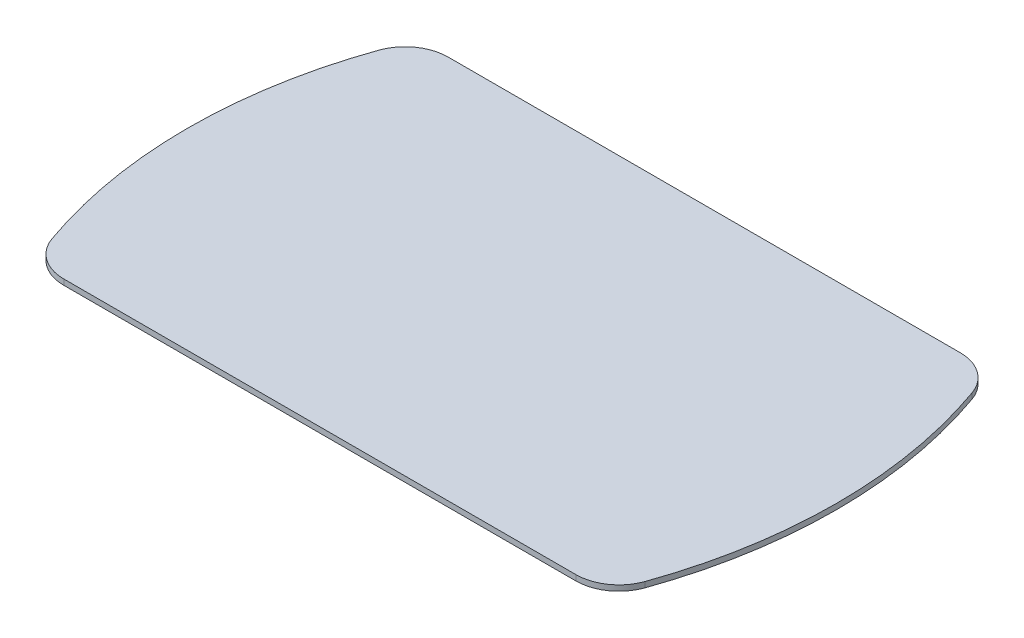
ISO-10303-21;
HEADER;
FILE_DESCRIPTION(('STEP AP214'),'2;1');
FILE_NAME('part.step','',(''),(''),'','','');
FILE_SCHEMA(('AUTOMOTIVE_DESIGN { 1 0 10303 214 1 1 1 1 }'));
ENDSEC;
DATA;
#1=APPLICATION_CONTEXT('core data for automotive mechanical design processes');
#2=APPLICATION_PROTOCOL_DEFINITION('international standard','automotive_design',2000,#1);
#3=PRODUCT_CONTEXT('',#1,'mechanical');
#4=PRODUCT('Part','Part','',(#3));
#5=PRODUCT_RELATED_PRODUCT_CATEGORY('part','',(#4));
#6=PRODUCT_DEFINITION_FORMATION('','',#4);
#7=PRODUCT_DEFINITION_CONTEXT('part definition',#1,'design');
#8=PRODUCT_DEFINITION('design','',#6,#7);
#9=PRODUCT_DEFINITION_SHAPE('','',#8);
#10=(LENGTH_UNIT() NAMED_UNIT(*) SI_UNIT(.MILLI.,.METRE.));
#11=(NAMED_UNIT(*) PLANE_ANGLE_UNIT() SI_UNIT($,.RADIAN.));
#12=(NAMED_UNIT(*) SI_UNIT($,.STERADIAN.) SOLID_ANGLE_UNIT());
#13=UNCERTAINTY_MEASURE_WITH_UNIT(LENGTH_MEASURE(1.E-05),#10,'distance_accuracy_value','');
#14=(GEOMETRIC_REPRESENTATION_CONTEXT(3) GLOBAL_UNCERTAINTY_ASSIGNED_CONTEXT((#13)) GLOBAL_UNIT_ASSIGNED_CONTEXT((#10,
#11,#12)) REPRESENTATION_CONTEXT('',''));
#15=CARTESIAN_POINT('',(0.,0.,0.));
#16=DIRECTION('',(0.,0.,1.));
#17=DIRECTION('',(1.,0.,0.));
#18=AXIS2_PLACEMENT_3D('',#15,#16,#17);
#19=CARTESIAN_POINT('',(23.1837661840735,0.,-13.5000000000002));
#20=DIRECTION('',(0.,1.,0.));
#21=DIRECTION('',(0.,0.,1.));
#22=AXIS2_PLACEMENT_3D('',#19,#20,#21);
#23=PLANE('',#22);
#24=CARTESIAN_POINT('',(-15.,0.,0.));
#25=DIRECTION('',(0.,-1.,0.));
#26=DIRECTION('',(0.,0.,-1.));
#27=AXIS2_PLACEMENT_3D('',#24,#25,#26);
#28=CIRCLE('',#27,44.4000000000004);
#29=CARTESIAN_POINT('',(26.8607214462441,0.,14.7999999999999));
#30=VERTEX_POINT('',#29);
#31=CARTESIAN_POINT('',(26.860721446244,0.,-14.8000000000004));
#32=VERTEX_POINT('',#31);
#33=EDGE_CURVE('E82',#30,#32,#28,.F.);
#34=ORIENTED_EDGE('',*,*,#33,.F.);
#35=CARTESIAN_POINT('',(23.1837661840736,0.,13.4999999999998));
#36=DIRECTION('',(0.,-1.,0.));
#37=DIRECTION('',(0.,0.,-1.));
#38=AXIS2_PLACEMENT_3D('',#35,#36,#37);
#39=CIRCLE('',#38,3.90000000000043);
#40=CARTESIAN_POINT('',(23.1837661840736,0.,17.4000000000002));
#41=VERTEX_POINT('',#40);
#42=EDGE_CURVE('E99',#41,#30,#39,.F.);
#43=ORIENTED_EDGE('',*,*,#42,.F.);
#44=DIRECTION('',(-1.,0.,0.));
#45=VECTOR('',#44,1.);
#46=CARTESIAN_POINT('',(-23.1837661840735,0.,17.4000000000006));
#47=LINE('',#46,#45);
#48=CARTESIAN_POINT('',(-23.1837661840735,0.,17.4000000000006));
#49=VERTEX_POINT('',#48);
#50=EDGE_CURVE('E105',#41,#49,#47,.T.);
#51=ORIENTED_EDGE('',*,*,#50,.T.);
#52=CARTESIAN_POINT('',(-23.1837661840735,0.,13.5000000000002));
#53=DIRECTION('',(0.,-1.,0.));
#54=DIRECTION('',(0.,0.,-1.));
#55=AXIS2_PLACEMENT_3D('',#52,#53,#54);
#56=CIRCLE('',#55,3.90000000000043);
#57=CARTESIAN_POINT('',(-26.860721446244,0.,14.8000000000004));
#58=VERTEX_POINT('',#57);
#59=EDGE_CURVE('E106',#58,#49,#56,.F.);
#60=ORIENTED_EDGE('',*,*,#59,.F.);
#61=CARTESIAN_POINT('',(15.,0.,0.));
#62=DIRECTION('',(0.,-1.,0.));
#63=DIRECTION('',(0.,0.,-1.));
#64=AXIS2_PLACEMENT_3D('',#61,#62,#63);
#65=CIRCLE('',#64,44.4000000000004);
#66=CARTESIAN_POINT('',(-26.8607214462441,0.,-14.7999999999999));
#67=VERTEX_POINT('',#66);
#68=EDGE_CURVE('E110',#67,#58,#65,.F.);
#69=ORIENTED_EDGE('',*,*,#68,.F.);
#70=CARTESIAN_POINT('',(-23.1837661840736,0.,-13.4999999999998));
#71=DIRECTION('',(0.,-1.,0.));
#72=DIRECTION('',(0.,0.,-1.));
#73=AXIS2_PLACEMENT_3D('',#70,#71,#72);
#74=CIRCLE('',#73,3.90000000000044);
#75=CARTESIAN_POINT('',(-23.1837661840736,0.,-17.4000000000002));
#76=VERTEX_POINT('',#75);
#77=EDGE_CURVE('E113',#76,#67,#74,.F.);
#78=ORIENTED_EDGE('',*,*,#77,.F.);
#79=DIRECTION('',(1.,0.,0.));
#80=VECTOR('',#79,1.);
#81=CARTESIAN_POINT('',(23.1837661840735,0.,-17.4000000000006));
#82=LINE('',#81,#80);
#83=CARTESIAN_POINT('',(23.1837661840735,0.,-17.4000000000006));
#84=VERTEX_POINT('',#83);
#85=EDGE_CURVE('E84',#76,#84,#82,.T.);
#86=ORIENTED_EDGE('',*,*,#85,.T.);
#87=CARTESIAN_POINT('',(23.1837661840735,0.,-13.5000000000002));
#88=DIRECTION('',(0.,-1.,0.));
#89=DIRECTION('',(0.,0.,-1.));
#90=AXIS2_PLACEMENT_3D('',#87,#88,#89);
#91=CIRCLE('',#90,3.90000000000041);
#92=EDGE_CURVE('E20',#32,#84,#91,.F.);
#93=ORIENTED_EDGE('',*,*,#92,.F.);
#94=EDGE_LOOP('',(#34,#43,#51,#60,#69,#78,#86,#93));
#95=FACE_BOUND('',#94,.T.);
#96=ADVANCED_FACE('F17',(#95),#23,.F.);
#97=CARTESIAN_POINT('',(23.1837661840735,0.5,-13.5000000000002));
#98=DIRECTION('',(0.,-1.,0.));
#99=DIRECTION('',(0.,0.,-1.));
#100=AXIS2_PLACEMENT_3D('',#97,#98,#99);
#101=CYLINDRICAL_SURFACE('',#100,3.90000000000041);
#102=CARTESIAN_POINT('',(23.1837661840735,0.5,-13.5000000000002));
#103=DIRECTION('',(0.,-1.,0.));
#104=DIRECTION('',(0.,0.,-1.));
#105=AXIS2_PLACEMENT_3D('',#102,#103,#104);
#106=CIRCLE('',#105,3.90000000000041);
#107=CARTESIAN_POINT('',(26.860721446244,0.5,-14.8000000000004));
#108=VERTEX_POINT('',#107);
#109=CARTESIAN_POINT('',(23.1837661840735,0.5,-17.4000000000006));
#110=VERTEX_POINT('',#109);
#111=EDGE_CURVE('E92',#108,#110,#106,.F.);
#112=ORIENTED_EDGE('',*,*,#111,.F.);
#113=DIRECTION('',(0.,-1.,0.));
#114=VECTOR('',#113,1.);
#115=CARTESIAN_POINT('',(26.860721446244,0.5,-14.8000000000004));
#116=LINE('',#115,#114);
#117=EDGE_CURVE('E89',#32,#108,#116,.F.);
#118=ORIENTED_EDGE('',*,*,#117,.F.);
#119=ORIENTED_EDGE('',*,*,#92,.T.);
#120=DIRECTION('',(0.,1.,0.));
#121=VECTOR('',#120,1.);
#122=CARTESIAN_POINT('',(23.1837661840735,0.5,-17.4000000000006));
#123=LINE('',#122,#121);
#124=EDGE_CURVE('E87',#84,#110,#123,.T.);
#125=ORIENTED_EDGE('',*,*,#124,.T.);
#126=EDGE_LOOP('',(#112,#118,#119,#125));
#127=FACE_BOUND('',#126,.T.);
#128=ADVANCED_FACE('F90',(#127),#101,.T.);
#129=CARTESIAN_POINT('',(23.1837661840735,0.5,-17.4000000000006));
#130=DIRECTION('',(0.,0.,1.));
#131=DIRECTION('',(1.,0.,0.));
#132=AXIS2_PLACEMENT_3D('',#129,#130,#131);
#133=PLANE('',#132);
#134=DIRECTION('',(0.,-1.,0.));
#135=VECTOR('',#134,1.);
#136=CARTESIAN_POINT('',(-23.1837661840736,0.5,-17.4000000000002));
#137=LINE('',#136,#135);
#138=CARTESIAN_POINT('',(-23.1837661840736,0.5,-17.4000000000004));
#139=VERTEX_POINT('',#138);
#140=EDGE_CURVE('E112',#139,#76,#137,.T.);
#141=ORIENTED_EDGE('',*,*,#140,.F.);
#142=DIRECTION('',(1.,0.,0.));
#143=VECTOR('',#142,1.);
#144=CARTESIAN_POINT('',(23.1837661840735,0.5,-17.4000000000006));
#145=LINE('',#144,#143);
#146=EDGE_CURVE('E133',#110,#139,#145,.F.);
#147=ORIENTED_EDGE('',*,*,#146,.F.);
#148=ORIENTED_EDGE('',*,*,#124,.F.);
#149=ORIENTED_EDGE('',*,*,#85,.F.);
#150=EDGE_LOOP('',(#141,#147,#148,#149));
#151=FACE_BOUND('',#150,.T.);
#152=ADVANCED_FACE('F151',(#151),#133,.F.);
#153=CARTESIAN_POINT('',(-23.1837661840736,0.5,-13.4999999999998));
#154=DIRECTION('',(0.,-1.,0.));
#155=DIRECTION('',(0.,0.,-1.));
#156=AXIS2_PLACEMENT_3D('',#153,#154,#155);
#157=CYLINDRICAL_SURFACE('',#156,3.90000000000044);
#158=CARTESIAN_POINT('',(-23.1837661840736,0.5,-13.4999999999998));
#159=DIRECTION('',(0.,-1.,0.));
#160=DIRECTION('',(0.,0.,-1.));
#161=AXIS2_PLACEMENT_3D('',#158,#159,#160);
#162=CIRCLE('',#161,3.90000000000044);
#163=CARTESIAN_POINT('',(-26.8607214462441,0.5,-14.7999999999999));
#164=VERTEX_POINT('',#163);
#165=EDGE_CURVE('E131',#139,#164,#162,.F.);
#166=ORIENTED_EDGE('',*,*,#165,.F.);
#167=ORIENTED_EDGE('',*,*,#140,.T.);
#168=ORIENTED_EDGE('',*,*,#77,.T.);
#169=DIRECTION('',(0.,-1.,0.));
#170=VECTOR('',#169,1.);
#171=CARTESIAN_POINT('',(-26.8607214462441,0.5,-14.7999999999999));
#172=LINE('',#171,#170);
#173=EDGE_CURVE('E109',#164,#67,#172,.T.);
#174=ORIENTED_EDGE('',*,*,#173,.F.);
#175=EDGE_LOOP('',(#166,#167,#168,#174));
#176=FACE_BOUND('',#175,.T.);
#177=ADVANCED_FACE('F149',(#176),#157,.T.);
#178=CARTESIAN_POINT('',(15.,0.5,0.));
#179=DIRECTION('',(0.,-1.,0.));
#180=DIRECTION('',(0.,0.,-1.));
#181=AXIS2_PLACEMENT_3D('',#178,#179,#180);
#182=CYLINDRICAL_SURFACE('',#181,44.4000000000004);
#183=CARTESIAN_POINT('',(15.,0.5,0.));
#184=DIRECTION('',(0.,-1.,0.));
#185=DIRECTION('',(0.,0.,-1.));
#186=AXIS2_PLACEMENT_3D('',#183,#184,#185);
#187=CIRCLE('',#186,44.4000000000004);
#188=CARTESIAN_POINT('',(-26.860721446244,0.5,14.8000000000004));
#189=VERTEX_POINT('',#188);
#190=EDGE_CURVE('E129',#164,#189,#187,.F.);
#191=ORIENTED_EDGE('',*,*,#190,.F.);
#192=ORIENTED_EDGE('',*,*,#173,.T.);
#193=ORIENTED_EDGE('',*,*,#68,.T.);
#194=DIRECTION('',(0.,-1.,0.));
#195=VECTOR('',#194,1.);
#196=CARTESIAN_POINT('',(-26.860721446244,0.5,14.8000000000004));
#197=LINE('',#196,#195);
#198=EDGE_CURVE('E108',#189,#58,#197,.T.);
#199=ORIENTED_EDGE('',*,*,#198,.F.);
#200=EDGE_LOOP('',(#191,#192,#193,#199));
#201=FACE_BOUND('',#200,.T.);
#202=ADVANCED_FACE('F148',(#201),#182,.T.);
#203=CARTESIAN_POINT('',(-23.1837661840735,0.5,13.5000000000002));
#204=DIRECTION('',(0.,-1.,0.));
#205=DIRECTION('',(0.,0.,-1.));
#206=AXIS2_PLACEMENT_3D('',#203,#204,#205);
#207=CYLINDRICAL_SURFACE('',#206,3.90000000000043);
#208=CARTESIAN_POINT('',(-23.1837661840735,0.5,13.5000000000002));
#209=DIRECTION('',(0.,-1.,0.));
#210=DIRECTION('',(0.,0.,-1.));
#211=AXIS2_PLACEMENT_3D('',#208,#209,#210);
#212=CIRCLE('',#211,3.90000000000043);
#213=CARTESIAN_POINT('',(-23.1837661840735,0.5,17.4000000000006));
#214=VERTEX_POINT('',#213);
#215=EDGE_CURVE('E126',#189,#214,#212,.F.);
#216=ORIENTED_EDGE('',*,*,#215,.F.);
#217=ORIENTED_EDGE('',*,*,#198,.T.);
#218=ORIENTED_EDGE('',*,*,#59,.T.);
#219=DIRECTION('',(0.,1.,0.));
#220=VECTOR('',#219,1.);
#221=CARTESIAN_POINT('',(-23.1837661840735,0.5,17.4000000000006));
#222=LINE('',#221,#220);
#223=EDGE_CURVE('E142',#49,#214,#222,.T.);
#224=ORIENTED_EDGE('',*,*,#223,.T.);
#225=EDGE_LOOP('',(#216,#217,#218,#224));
#226=FACE_BOUND('',#225,.T.);
#227=ADVANCED_FACE('F163',(#226),#207,.T.);
#228=CARTESIAN_POINT('',(-23.1837661840735,0.5,17.4000000000006));
#229=DIRECTION('',(0.,0.,-1.));
#230=DIRECTION('',(-1.,0.,0.));
#231=AXIS2_PLACEMENT_3D('',#228,#229,#230);
#232=PLANE('',#231);
#233=DIRECTION('',(0.,-1.,0.));
#234=VECTOR('',#233,1.);
#235=CARTESIAN_POINT('',(23.1837661840736,0.5,17.4000000000002));
#236=LINE('',#235,#234);
#237=CARTESIAN_POINT('',(23.1837661840736,0.5,17.4000000000004));
#238=VERTEX_POINT('',#237);
#239=EDGE_CURVE('E96',#238,#41,#236,.T.);
#240=ORIENTED_EDGE('',*,*,#239,.F.);
#241=DIRECTION('',(1.,0.,0.));
#242=VECTOR('',#241,1.);
#243=CARTESIAN_POINT('',(23.1837661840735,0.5,17.4000000000006));
#244=LINE('',#243,#242);
#245=EDGE_CURVE('E125',#214,#238,#244,.T.);
#246=ORIENTED_EDGE('',*,*,#245,.F.);
#247=ORIENTED_EDGE('',*,*,#223,.F.);
#248=ORIENTED_EDGE('',*,*,#50,.F.);
#249=EDGE_LOOP('',(#240,#246,#247,#248));
#250=FACE_BOUND('',#249,.T.);
#251=ADVANCED_FACE('F158',(#250),#232,.F.);
#252=CARTESIAN_POINT('',(23.1837661840736,0.5,13.4999999999998));
#253=DIRECTION('',(0.,-1.,0.));
#254=DIRECTION('',(0.,0.,-1.));
#255=AXIS2_PLACEMENT_3D('',#252,#253,#254);
#256=CYLINDRICAL_SURFACE('',#255,3.90000000000043);
#257=CARTESIAN_POINT('',(23.1837661840736,0.5,13.4999999999998));
#258=DIRECTION('',(0.,-1.,0.));
#259=DIRECTION('',(0.,0.,-1.));
#260=AXIS2_PLACEMENT_3D('',#257,#258,#259);
#261=CIRCLE('',#260,3.90000000000043);
#262=CARTESIAN_POINT('',(26.8607214462441,0.5,14.7999999999999));
#263=VERTEX_POINT('',#262);
#264=EDGE_CURVE('E26',#238,#263,#261,.F.);
#265=ORIENTED_EDGE('',*,*,#264,.F.);
#266=ORIENTED_EDGE('',*,*,#239,.T.);
#267=ORIENTED_EDGE('',*,*,#42,.T.);
#268=DIRECTION('',(0.,-1.,0.));
#269=VECTOR('',#268,1.);
#270=CARTESIAN_POINT('',(26.8607214462441,0.5,14.7999999999999));
#271=LINE('',#270,#269);
#272=EDGE_CURVE('E35',#263,#30,#271,.T.);
#273=ORIENTED_EDGE('',*,*,#272,.F.);
#274=EDGE_LOOP('',(#265,#266,#267,#273));
#275=FACE_BOUND('',#274,.T.);
#276=ADVANCED_FACE('F155',(#275),#256,.T.);
#277=CARTESIAN_POINT('',(-15.,0.5,0.));
#278=DIRECTION('',(0.,-1.,0.));
#279=DIRECTION('',(0.,0.,-1.));
#280=AXIS2_PLACEMENT_3D('',#277,#278,#279);
#281=CYLINDRICAL_SURFACE('',#280,44.4000000000004);
#282=CARTESIAN_POINT('',(-15.,0.5,0.));
#283=DIRECTION('',(0.,-1.,0.));
#284=DIRECTION('',(0.,0.,-1.));
#285=AXIS2_PLACEMENT_3D('',#282,#283,#284);
#286=CIRCLE('',#285,44.4000000000004);
#287=EDGE_CURVE('E11',#263,#108,#286,.F.);
#288=ORIENTED_EDGE('',*,*,#287,.F.);
#289=ORIENTED_EDGE('',*,*,#272,.T.);
#290=ORIENTED_EDGE('',*,*,#33,.T.);
#291=ORIENTED_EDGE('',*,*,#117,.T.);
#292=EDGE_LOOP('',(#288,#289,#290,#291));
#293=FACE_BOUND('',#292,.T.);
#294=ADVANCED_FACE('F95',(#293),#281,.T.);
#295=CARTESIAN_POINT('',(23.1837661840735,0.5,-13.5000000000002));
#296=DIRECTION('',(0.,1.,0.));
#297=DIRECTION('',(0.,0.,1.));
#298=AXIS2_PLACEMENT_3D('',#295,#296,#297);
#299=PLANE('',#298);
#300=ORIENTED_EDGE('',*,*,#264,.T.);
#301=ORIENTED_EDGE('',*,*,#287,.T.);
#302=ORIENTED_EDGE('',*,*,#111,.T.);
#303=ORIENTED_EDGE('',*,*,#146,.T.);
#304=ORIENTED_EDGE('',*,*,#165,.T.);
#305=ORIENTED_EDGE('',*,*,#190,.T.);
#306=ORIENTED_EDGE('',*,*,#215,.T.);
#307=ORIENTED_EDGE('',*,*,#245,.T.);
#308=EDGE_LOOP('',(#300,#301,#302,#303,#304,#305,#306,#307));
#309=FACE_BOUND('',#308,.T.);
#310=ADVANCED_FACE('F152',(#309),#299,.T.);
#311=CLOSED_SHELL('',(#96,#128,#152,#177,#202,#227,#251,#276,#294,#310));
#312=MANIFOLD_SOLID_BREP('B1',#311);
#313=ADVANCED_BREP_SHAPE_REPRESENTATION('',(#18,#312),#14);
#314=SHAPE_DEFINITION_REPRESENTATION(#9,#313);
ENDSEC;
END-ISO-10303-21;
